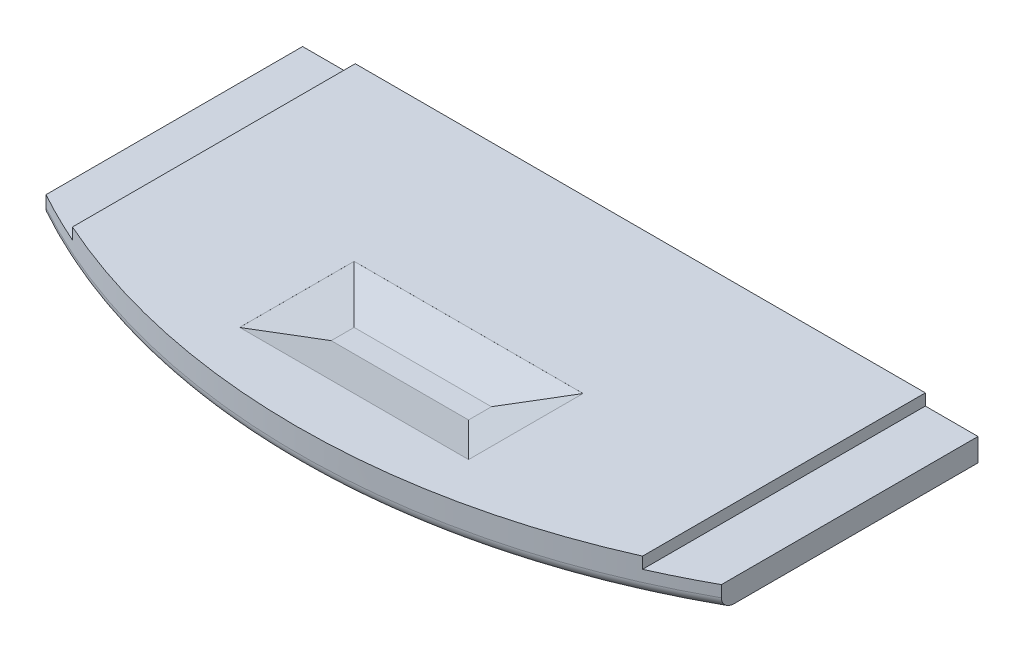
ISO-10303-21;
HEADER;
FILE_DESCRIPTION(('STEP AP214'),'2;1');
FILE_NAME('part.step','',(''),(''),'','','');
FILE_SCHEMA(('AUTOMOTIVE_DESIGN { 1 0 10303 214 1 1 1 1 }'));
ENDSEC;
DATA;
#1=APPLICATION_CONTEXT('core data for automotive mechanical design processes');
#2=APPLICATION_PROTOCOL_DEFINITION('international standard','automotive_design',2000,#1);
#3=PRODUCT_CONTEXT('',#1,'mechanical');
#4=PRODUCT('Part','Part','',(#3));
#5=PRODUCT_RELATED_PRODUCT_CATEGORY('part','',(#4));
#6=PRODUCT_DEFINITION_FORMATION('','',#4);
#7=PRODUCT_DEFINITION_CONTEXT('part definition',#1,'design');
#8=PRODUCT_DEFINITION('design','',#6,#7);
#9=PRODUCT_DEFINITION_SHAPE('','',#8);
#10=(LENGTH_UNIT() NAMED_UNIT(*) SI_UNIT(.MILLI.,.METRE.));
#11=(NAMED_UNIT(*) PLANE_ANGLE_UNIT() SI_UNIT($,.RADIAN.));
#12=(NAMED_UNIT(*) SI_UNIT($,.STERADIAN.) SOLID_ANGLE_UNIT());
#13=UNCERTAINTY_MEASURE_WITH_UNIT(LENGTH_MEASURE(1.E-05),#10,'distance_accuracy_value','');
#14=(GEOMETRIC_REPRESENTATION_CONTEXT(3) GLOBAL_UNCERTAINTY_ASSIGNED_CONTEXT((#13)) GLOBAL_UNIT_ASSIGNED_CONTEXT((#10,
#11,#12)) REPRESENTATION_CONTEXT('',''));
#15=CARTESIAN_POINT('',(0.,0.,0.));
#16=DIRECTION('',(0.,0.,1.));
#17=DIRECTION('',(1.,0.,0.));
#18=AXIS2_PLACEMENT_3D('',#15,#16,#17);
#19=CARTESIAN_POINT('',(15.8115,1.905,19.05));
#20=DIRECTION('',(0.,-1.,0.));
#21=DIRECTION('',(1.,0.,0.));
#22=AXIS2_PLACEMENT_3D('',#19,#20,#21);
#23=PLANE('',#22);
#24=DIRECTION('',(-1.,0.,0.));
#25=VECTOR('',#24,1.);
#26=CARTESIAN_POINT('',(-6.35,1.905,9.525));
#27=LINE('',#26,#25);
#28=CARTESIAN_POINT('',(6.35,1.905,9.525));
#29=VERTEX_POINT('',#28);
#30=CARTESIAN_POINT('',(-6.35,1.905,9.525));
#31=VERTEX_POINT('',#30);
#32=EDGE_CURVE('E492',#29,#31,#27,.T.);
#33=ORIENTED_EDGE('',*,*,#32,.F.);
#34=DIRECTION('',(0.,0.,-1.));
#35=VECTOR('',#34,1.);
#36=CARTESIAN_POINT('',(6.35,1.905,15.875));
#37=LINE('',#36,#35);
#38=CARTESIAN_POINT('',(6.35,1.905,15.875));
#39=VERTEX_POINT('',#38);
#40=EDGE_CURVE('E212',#39,#29,#37,.T.);
#41=ORIENTED_EDGE('',*,*,#40,.F.);
#42=DIRECTION('',(1.,0.,0.));
#43=VECTOR('',#42,1.);
#44=CARTESIAN_POINT('',(-6.35,1.905,15.875));
#45=LINE('',#44,#43);
#46=CARTESIAN_POINT('',(-6.35,1.905,15.875));
#47=VERTEX_POINT('',#46);
#48=EDGE_CURVE('E474',#47,#39,#45,.T.);
#49=ORIENTED_EDGE('',*,*,#48,.F.);
#50=DIRECTION('',(0.,0.,1.));
#51=VECTOR('',#50,1.);
#52=CARTESIAN_POINT('',(-6.35,1.905,15.875));
#53=LINE('',#52,#51);
#54=EDGE_CURVE('E497',#31,#47,#53,.T.);
#55=ORIENTED_EDGE('',*,*,#54,.F.);
#56=EDGE_LOOP('',(#33,#41,#49,#55));
#57=FACE_BOUND('',#56,.T.);
#58=DIRECTION('',(0.,0.,-1.));
#59=VECTOR('',#58,1.);
#60=CARTESIAN_POINT('',(-15.8115,1.905,19.05));
#61=LINE('',#60,#59);
#62=CARTESIAN_POINT('',(-15.8115,1.905,15.6856140175941));
#63=VERTEX_POINT('',#62);
#64=CARTESIAN_POINT('',(-15.8115,1.905,0.));
#65=VERTEX_POINT('',#64);
#66=EDGE_CURVE('E163',#63,#65,#61,.T.);
#67=ORIENTED_EDGE('',*,*,#66,.F.);
#68=CARTESIAN_POINT('',(0.,1.905,-19.7866));
#69=DIRECTION('',(0.,-1.,0.));
#70=DIRECTION('',(-1.,0.,0.));
#71=AXIS2_PLACEMENT_3D('',#68,#69,#70);
#72=CIRCLE('',#71,38.8366);
#73=CARTESIAN_POINT('',(15.8115,1.905,15.6856140175941));
#74=VERTEX_POINT('',#73);
#75=EDGE_CURVE('E149',#74,#63,#72,.T.);
#76=ORIENTED_EDGE('',*,*,#75,.F.);
#77=DIRECTION('',(0.,0.,-1.));
#78=VECTOR('',#77,1.);
#79=CARTESIAN_POINT('',(15.8115,1.905,19.05));
#80=LINE('',#79,#78);
#81=CARTESIAN_POINT('',(15.8115,1.905,0.));
#82=VERTEX_POINT('',#81);
#83=EDGE_CURVE('E161',#74,#82,#80,.T.);
#84=ORIENTED_EDGE('',*,*,#83,.T.);
#85=DIRECTION('',(-1.,0.,0.));
#86=VECTOR('',#85,1.);
#87=CARTESIAN_POINT('',(15.8115,1.905,0.));
#88=LINE('',#87,#86);
#89=EDGE_CURVE('E320',#82,#65,#88,.T.);
#90=ORIENTED_EDGE('',*,*,#89,.T.);
#91=EDGE_LOOP('',(#67,#76,#84,#90));
#92=FACE_BOUND('',#91,.T.);
#93=ADVANCED_FACE('F37',(#57,#92),#23,.F.);
#94=CARTESIAN_POINT('',(-15.8115,1.27,19.05));
#95=DIRECTION('',(0.,-1.,0.));
#96=DIRECTION('',(1.,0.,0.));
#97=AXIS2_PLACEMENT_3D('',#94,#95,#96);
#98=PLANE('',#97);
#99=DIRECTION('',(0.,0.,-1.));
#100=VECTOR('',#99,1.);
#101=CARTESIAN_POINT('',(-18.7325,1.27,19.05));
#102=LINE('',#101,#100);
#103=CARTESIAN_POINT('',(-18.7325,1.27000000000001,14.2336137458012));
#104=VERTEX_POINT('',#103);
#105=CARTESIAN_POINT('',(-18.7325,1.27,0.));
#106=VERTEX_POINT('',#105);
#107=EDGE_CURVE('E300',#104,#106,#102,.T.);
#108=ORIENTED_EDGE('',*,*,#107,.F.);
#109=CARTESIAN_POINT('',(0.,1.27,-19.7866));
#110=DIRECTION('',(0.,-1.,0.));
#111=DIRECTION('',(1.,0.,0.));
#112=AXIS2_PLACEMENT_3D('',#109,#110,#111);
#113=CIRCLE('',#112,38.8366);
#114=CARTESIAN_POINT('',(-15.8115,1.27,15.6856140175941));
#115=VERTEX_POINT('',#114);
#116=EDGE_CURVE('E330',#104,#115,#113,.F.);
#117=ORIENTED_EDGE('',*,*,#116,.T.);
#118=DIRECTION('',(0.,0.,-1.));
#119=VECTOR('',#118,1.);
#120=CARTESIAN_POINT('',(-15.8115,1.27,19.05));
#121=LINE('',#120,#119);
#122=CARTESIAN_POINT('',(-15.8115,1.27,0.));
#123=VERTEX_POINT('',#122);
#124=EDGE_CURVE('E174',#115,#123,#121,.T.);
#125=ORIENTED_EDGE('',*,*,#124,.T.);
#126=DIRECTION('',(-1.,0.,0.));
#127=VECTOR('',#126,1.);
#128=CARTESIAN_POINT('',(-15.8115,1.27,0.));
#129=LINE('',#128,#127);
#130=EDGE_CURVE('E325',#123,#106,#129,.T.);
#131=ORIENTED_EDGE('',*,*,#130,.T.);
#132=EDGE_LOOP('',(#108,#117,#125,#131));
#133=FACE_BOUND('',#132,.T.);
#134=ADVANCED_FACE('F226',(#133),#98,.F.);
#135=CARTESIAN_POINT('',(-18.7325,1.27,19.05));
#136=DIRECTION('',(1.,0.,0.));
#137=DIRECTION('',(0.,0.,-1.));
#138=AXIS2_PLACEMENT_3D('',#135,#136,#137);
#139=PLANE('',#138);
#140=DIRECTION('',(0.,0.,-1.));
#141=VECTOR('',#140,1.);
#142=CARTESIAN_POINT('',(-18.7325,0.,19.05));
#143=LINE('',#142,#141);
#144=CARTESIAN_POINT('',(-18.7325,0.,13.5068781347639));
#145=VERTEX_POINT('',#144);
#146=CARTESIAN_POINT('',(-18.7325,0.,0.));
#147=VERTEX_POINT('',#146);
#148=EDGE_CURVE('E181',#145,#147,#143,.T.);
#149=ORIENTED_EDGE('',*,*,#148,.F.);
#150=CARTESIAN_POINT('',(-18.7325,0.,13.5068781347639));
#151=CARTESIAN_POINT('',(-18.7325,-7.18038368349502E-06,13.5525097263619));
#152=CARTESIAN_POINT('',(-18.7325,0.00373725896533657,13.5981743834264));
#153=CARTESIAN_POINT('',(-18.7325,0.018749581351385,13.688454082777));
#154=CARTESIAN_POINT('',(-18.7325,0.0300509823219953,13.7330635280731));
#155=CARTESIAN_POINT('',(-18.7325,0.0602297507406202,13.8197788721495));
#156=CARTESIAN_POINT('',(-18.7325,0.0791233217712156,13.8618791937359));
#157=CARTESIAN_POINT('',(-18.7325,0.124315953022304,13.941854795761));
#158=CARTESIAN_POINT('',(-18.7325,0.150602427601653,13.9797371052418));
#159=CARTESIAN_POINT('',(-18.7325,0.207651165815531,14.0466219787454));
#160=CARTESIAN_POINT('',(-18.7325,0.237848628092664,14.076104087258));
#161=CARTESIAN_POINT('',(-18.7325,0.303456193210352,14.1286096302779));
#162=CARTESIAN_POINT('',(-18.7325,0.338863547799581,14.1516364514977));
#163=CARTESIAN_POINT('',(-18.7325,0.408613135639765,14.1871816821384));
#164=CARTESIAN_POINT('',(-18.7325,0.442445200057152,14.2007033963452));
#165=CARTESIAN_POINT('',(-18.7325,0.512003722748774,14.2210559887519));
#166=CARTESIAN_POINT('',(-18.7325,0.54772457362038,14.2279056154163));
#167=CARTESIAN_POINT('',(-18.7325,0.600781975948257,14.2328295531138));
#168=CARTESIAN_POINT('',(-18.7325,0.617896245231534,14.233625312789));
#169=CARTESIAN_POINT('',(-18.7325,0.634999999999999,14.2336137458012));
#170=B_SPLINE_CURVE_WITH_KNOTS('',3,(#150,#151,#152,#153,#154,#155,#156,#157,#158,#159,#160,
#161,#162,#163,#164,#165,#166,#167,#168,#169),.UNSPECIFIED.,.F.,.F.,(4,2,2,2,2,2,2,2,2,4),(0.,
0.136797003369236,0.274204812801076,0.411907455673943,0.549377078690826,0.675247400741318,
0.801051561864762,0.909744434593278,1.01813099328472,1.06945363196418),.UNSPECIFIED.);
#171=CARTESIAN_POINT('',(-18.7325,0.635,14.2336137458012));
#172=VERTEX_POINT('',#171);
#173=EDGE_CURVE('E65',#145,#172,#170,.T.);
#174=ORIENTED_EDGE('',*,*,#173,.T.);
#175=DIRECTION('',(0.,1.,0.));
#176=VECTOR('',#175,1.);
#177=CARTESIAN_POINT('',(-18.7325,0.,14.2336137458012));
#178=LINE('',#177,#176);
#179=EDGE_CURVE('E290',#172,#104,#178,.T.);
#180=ORIENTED_EDGE('',*,*,#179,.T.);
#181=ORIENTED_EDGE('',*,*,#107,.T.);
#182=DIRECTION('',(0.,-1.,0.));
#183=VECTOR('',#182,1.);
#184=CARTESIAN_POINT('',(-18.7325,1.27,0.));
#185=LINE('',#184,#183);
#186=EDGE_CURVE('E298',#106,#147,#185,.T.);
#187=ORIENTED_EDGE('',*,*,#186,.T.);
#188=EDGE_LOOP('',(#149,#174,#180,#181,#187));
#189=FACE_BOUND('',#188,.T.);
#190=ADVANCED_FACE('F220',(#189),#139,.F.);
#191=CARTESIAN_POINT('',(-18.7325,0.,19.05));
#192=DIRECTION('',(0.,1.,0.));
#193=DIRECTION('',(-1.,0.,0.));
#194=AXIS2_PLACEMENT_3D('',#191,#192,#193);
#195=PLANE('',#194);
#196=DIRECTION('',(0.,0.,-1.));
#197=VECTOR('',#196,1.);
#198=CARTESIAN_POINT('',(18.7325,0.,19.05));
#199=LINE('',#198,#197);
#200=CARTESIAN_POINT('',(18.7325,0.,13.5068781347639));
#201=VERTEX_POINT('',#200);
#202=CARTESIAN_POINT('',(18.7325,0.,0.));
#203=VERTEX_POINT('',#202);
#204=EDGE_CURVE('E179',#201,#203,#199,.T.);
#205=ORIENTED_EDGE('',*,*,#204,.F.);
#206=CARTESIAN_POINT('',(0.,0.,-19.7866));
#207=DIRECTION('',(0.,1.,0.));
#208=DIRECTION('',(-1.,0.,0.));
#209=AXIS2_PLACEMENT_3D('',#206,#207,#208);
#210=CIRCLE('',#209,38.2016);
#211=EDGE_CURVE('E201',#201,#145,#210,.F.);
#212=ORIENTED_EDGE('',*,*,#211,.T.);
#213=ORIENTED_EDGE('',*,*,#148,.T.);
#214=DIRECTION('',(1.,0.,0.));
#215=VECTOR('',#214,1.);
#216=CARTESIAN_POINT('',(-18.7325,0.,0.));
#217=LINE('',#216,#215);
#218=EDGE_CURVE('E304',#147,#203,#217,.T.);
#219=ORIENTED_EDGE('',*,*,#218,.T.);
#220=EDGE_LOOP('',(#205,#212,#213,#219));
#221=FACE_BOUND('',#220,.T.);
#222=ADVANCED_FACE('F225',(#221),#195,.F.);
#223=CARTESIAN_POINT('',(18.7325,0.,19.05));
#224=DIRECTION('',(-1.,0.,0.));
#225=DIRECTION('',(0.,0.,1.));
#226=AXIS2_PLACEMENT_3D('',#223,#224,#225);
#227=PLANE('',#226);
#228=DIRECTION('',(0.,1.,0.));
#229=VECTOR('',#228,1.);
#230=CARTESIAN_POINT('',(18.7325,0.,14.2336137458012));
#231=LINE('',#230,#229);
#232=CARTESIAN_POINT('',(18.7325,0.635000000000007,14.2336137458012));
#233=VERTEX_POINT('',#232);
#234=CARTESIAN_POINT('',(18.7325,1.27000000000001,14.2336137458012));
#235=VERTEX_POINT('',#234);
#236=EDGE_CURVE('E164',#233,#235,#231,.T.);
#237=ORIENTED_EDGE('',*,*,#236,.F.);
#238=CARTESIAN_POINT('',(18.7325,0.635000000000007,14.2336137458012));
#239=CARTESIAN_POINT('',(18.7325,0.602451107551194,14.2336608440877));
#240=CARTESIAN_POINT('',(18.7325,0.569936368145078,14.2307602368648));
#241=CARTESIAN_POINT('',(18.7325,0.506011958465129,14.2194427836022));
#242=CARTESIAN_POINT('',(18.7325,0.474598345644455,14.2110483281439));
#243=CARTESIAN_POINT('',(18.7325,0.413657064326774,14.18912495296));
#244=CARTESIAN_POINT('',(18.7325,0.384128025711442,14.1755998141734));
#245=CARTESIAN_POINT('',(18.7325,0.327600735123386,14.1440031869236));
#246=CARTESIAN_POINT('',(18.7325,0.300604439129042,14.1259282237704));
#247=CARTESIAN_POINT('',(18.7325,0.248455616349783,14.084945511528));
#248=CARTESIAN_POINT('',(18.7325,0.22345254343684,14.0618483068935));
#249=CARTESIAN_POINT('',(18.7325,0.177186522303371,14.0121874903605));
#250=CARTESIAN_POINT('',(18.7325,0.155924322413831,13.9856231867443));
#251=CARTESIAN_POINT('',(18.7325,0.115093372565428,13.9264813773413));
#252=CARTESIAN_POINT('',(18.7325,0.0960172456732509,13.8935640768571));
#253=CARTESIAN_POINT('',(18.7325,0.0629571018671682,13.8252420870077));
#254=CARTESIAN_POINT('',(18.7325,0.0489787519119618,13.7898346813302));
#255=CARTESIAN_POINT('',(18.7325,0.0250461597425407,13.7137426602569));
#256=CARTESIAN_POINT('',(18.7325,0.015639896280906,13.6728859510476));
#257=CARTESIAN_POINT('',(18.7325,0.00312011287666644,13.5903016487957));
#258=CARTESIAN_POINT('',(18.7325,-6.24406686617483E-06,13.5485760088486));
#259=CARTESIAN_POINT('',(18.7325,0.,13.5068781347639));
#260=B_SPLINE_CURVE_WITH_KNOTS('',3,(#238,#239,#240,#241,#242,#243,#244,#245,#246,#247,#248,
#249,#250,#251,#252,#253,#254,#255,#256,#257,#258,#259),.UNSPECIFIED.,.F.,.F.,(4,2,2,2,2,2,2,2,
2,2,4),(0.,0.0974641339979622,0.194533498897658,0.291531469290527,0.388603742744613,
0.490308157582893,0.592032894480588,0.705711678471261,0.81951645136196,0.944798062571179,
1.06982331909117),.UNSPECIFIED.);
#261=EDGE_CURVE('E11',#233,#201,#260,.T.);
#262=ORIENTED_EDGE('',*,*,#261,.T.);
#263=ORIENTED_EDGE('',*,*,#204,.T.);
#264=DIRECTION('',(0.,1.,0.));
#265=VECTOR('',#264,1.);
#266=CARTESIAN_POINT('',(18.7325,0.,0.));
#267=LINE('',#266,#265);
#268=CARTESIAN_POINT('',(18.7325,1.27000000000001,0.));
#269=VERTEX_POINT('',#268);
#270=EDGE_CURVE('E307',#203,#269,#267,.T.);
#271=ORIENTED_EDGE('',*,*,#270,.T.);
#272=DIRECTION('',(0.,0.,-1.));
#273=VECTOR('',#272,1.);
#274=CARTESIAN_POINT('',(18.7325,1.27000000000001,19.05));
#275=LINE('',#274,#273);
#276=EDGE_CURVE('E172',#235,#269,#275,.T.);
#277=ORIENTED_EDGE('',*,*,#276,.F.);
#278=EDGE_LOOP('',(#237,#262,#263,#271,#277));
#279=FACE_BOUND('',#278,.T.);
#280=ADVANCED_FACE('F277',(#279),#227,.F.);
#281=CARTESIAN_POINT('',(18.7325,1.27000000000001,19.05));
#282=DIRECTION('',(0.,-1.,0.));
#283=DIRECTION('',(1.,0.,0.));
#284=AXIS2_PLACEMENT_3D('',#281,#282,#283);
#285=PLANE('',#284);
#286=DIRECTION('',(0.,0.,-1.));
#287=VECTOR('',#286,1.);
#288=CARTESIAN_POINT('',(15.8115,1.27000000000001,19.05));
#289=LINE('',#288,#287);
#290=CARTESIAN_POINT('',(15.8115,1.27000000000001,15.6856140175941));
#291=VERTEX_POINT('',#290);
#292=CARTESIAN_POINT('',(15.8115,1.27000000000001,0.));
#293=VERTEX_POINT('',#292);
#294=EDGE_CURVE('E170',#291,#293,#289,.T.);
#295=ORIENTED_EDGE('',*,*,#294,.F.);
#296=CARTESIAN_POINT('',(0.,1.27,-19.7866));
#297=DIRECTION('',(0.,-1.,0.));
#298=DIRECTION('',(1.,0.,0.));
#299=AXIS2_PLACEMENT_3D('',#296,#297,#298);
#300=CIRCLE('',#299,38.8366);
#301=EDGE_CURVE('E152',#291,#235,#300,.F.);
#302=ORIENTED_EDGE('',*,*,#301,.T.);
#303=ORIENTED_EDGE('',*,*,#276,.T.);
#304=DIRECTION('',(-1.,0.,0.));
#305=VECTOR('',#304,1.);
#306=CARTESIAN_POINT('',(18.7325,1.27000000000001,0.));
#307=LINE('',#306,#305);
#308=EDGE_CURVE('E316',#269,#293,#307,.T.);
#309=ORIENTED_EDGE('',*,*,#308,.T.);
#310=EDGE_LOOP('',(#295,#302,#303,#309));
#311=FACE_BOUND('',#310,.T.);
#312=ADVANCED_FACE('F275',(#311),#285,.F.);
#313=CARTESIAN_POINT('',(15.8115,1.27000000000001,19.05));
#314=DIRECTION('',(-1.,0.,0.));
#315=DIRECTION('',(0.,0.,1.));
#316=AXIS2_PLACEMENT_3D('',#313,#314,#315);
#317=PLANE('',#316);
#318=ORIENTED_EDGE('',*,*,#83,.F.);
#319=DIRECTION('',(0.,1.,0.));
#320=VECTOR('',#319,1.);
#321=CARTESIAN_POINT('',(15.8115,0.,15.6856140175941));
#322=LINE('',#321,#320);
#323=EDGE_CURVE('E146',#74,#291,#322,.F.);
#324=ORIENTED_EDGE('',*,*,#323,.T.);
#325=ORIENTED_EDGE('',*,*,#294,.T.);
#326=DIRECTION('',(0.,1.,0.));
#327=VECTOR('',#326,1.);
#328=CARTESIAN_POINT('',(15.8115,1.27000000000001,0.));
#329=LINE('',#328,#327);
#330=EDGE_CURVE('E168',#293,#82,#329,.T.);
#331=ORIENTED_EDGE('',*,*,#330,.T.);
#332=EDGE_LOOP('',(#318,#324,#325,#331));
#333=FACE_BOUND('',#332,.T.);
#334=ADVANCED_FACE('F166',(#333),#317,.F.);
#335=CARTESIAN_POINT('',(-15.8115,1.905,19.05));
#336=DIRECTION('',(1.,0.,0.));
#337=DIRECTION('',(0.,0.,-1.));
#338=AXIS2_PLACEMENT_3D('',#335,#336,#337);
#339=PLANE('',#338);
#340=ORIENTED_EDGE('',*,*,#124,.F.);
#341=DIRECTION('',(0.,1.,0.));
#342=VECTOR('',#341,1.);
#343=CARTESIAN_POINT('',(-15.8115,0.,15.6856140175941));
#344=LINE('',#343,#342);
#345=EDGE_CURVE('E156',#115,#63,#344,.T.);
#346=ORIENTED_EDGE('',*,*,#345,.T.);
#347=ORIENTED_EDGE('',*,*,#66,.T.);
#348=DIRECTION('',(0.,-1.,0.));
#349=VECTOR('',#348,1.);
#350=CARTESIAN_POINT('',(-15.8115,1.905,0.));
#351=LINE('',#350,#349);
#352=EDGE_CURVE('E322',#65,#123,#351,.T.);
#353=ORIENTED_EDGE('',*,*,#352,.T.);
#354=EDGE_LOOP('',(#340,#346,#347,#353));
#355=FACE_BOUND('',#354,.T.);
#356=ADVANCED_FACE('F272',(#355),#339,.F.);
#357=CARTESIAN_POINT('',(0.,0.,0.));
#358=DIRECTION('',(0.,0.,1.));
#359=DIRECTION('',(1.,0.,0.));
#360=AXIS2_PLACEMENT_3D('',#357,#358,#359);
#361=PLANE('',#360);
#362=ORIENTED_EDGE('',*,*,#186,.F.);
#363=ORIENTED_EDGE('',*,*,#130,.F.);
#364=ORIENTED_EDGE('',*,*,#352,.F.);
#365=ORIENTED_EDGE('',*,*,#89,.F.);
#366=ORIENTED_EDGE('',*,*,#330,.F.);
#367=ORIENTED_EDGE('',*,*,#308,.F.);
#368=ORIENTED_EDGE('',*,*,#270,.F.);
#369=ORIENTED_EDGE('',*,*,#218,.F.);
#370=EDGE_LOOP('',(#362,#363,#364,#365,#366,#367,#368,#369));
#371=FACE_BOUND('',#370,.T.);
#372=ADVANCED_FACE('F333',(#371),#361,.F.);
#373=CARTESIAN_POINT('',(6.35,1.27,15.875));
#374=DIRECTION('',(1.,0.,0.));
#375=DIRECTION('',(0.,1.,0.));
#376=AXIS2_PLACEMENT_3D('',#373,#374,#375);
#377=PLANE('',#376);
#378=DIRECTION('',(0.,1.,0.));
#379=VECTOR('',#378,1.);
#380=CARTESIAN_POINT('',(6.35,1.27,9.525));
#381=LINE('',#380,#379);
#382=CARTESIAN_POINT('',(6.35,1.90329312722168,9.525));
#383=VERTEX_POINT('',#382);
#384=EDGE_CURVE('E312',#383,#29,#381,.T.);
#385=ORIENTED_EDGE('',*,*,#384,.F.);
#386=DIRECTION('',(0.,0.,1.));
#387=VECTOR('',#386,1.);
#388=CARTESIAN_POINT('',(6.35,1.90329312722168,15.875));
#389=LINE('',#388,#387);
#390=CARTESIAN_POINT('',(6.35,1.90329312722168,15.875));
#391=VERTEX_POINT('',#390);
#392=EDGE_CURVE('E199',#383,#391,#389,.T.);
#393=ORIENTED_EDGE('',*,*,#392,.T.);
#394=DIRECTION('',(0.,1.,0.));
#395=VECTOR('',#394,1.);
#396=CARTESIAN_POINT('',(6.35,1.27,15.875));
#397=LINE('',#396,#395);
#398=EDGE_CURVE('E305',#391,#39,#397,.T.);
#399=ORIENTED_EDGE('',*,*,#398,.T.);
#400=ORIENTED_EDGE('',*,*,#40,.T.);
#401=EDGE_LOOP('',(#385,#393,#399,#400));
#402=FACE_BOUND('',#401,.T.);
#403=ADVANCED_FACE('F335',(#402),#377,.F.);
#404=CARTESIAN_POINT('',(-6.35,1.27,15.875));
#405=DIRECTION('',(0.,0.,1.));
#406=DIRECTION('',(1.,0.,0.));
#407=AXIS2_PLACEMENT_3D('',#404,#405,#406);
#408=PLANE('',#407);
#409=ORIENTED_EDGE('',*,*,#398,.F.);
#410=DIRECTION('',(-1.,0.,0.));
#411=VECTOR('',#410,1.);
#412=CARTESIAN_POINT('',(-6.35,1.90329312722168,15.875));
#413=LINE('',#412,#411);
#414=CARTESIAN_POINT('',(-6.35,1.90329312722168,15.875));
#415=VERTEX_POINT('',#414);
#416=EDGE_CURVE('E192',#391,#415,#413,.T.);
#417=ORIENTED_EDGE('',*,*,#416,.T.);
#418=DIRECTION('',(0.,1.,0.));
#419=VECTOR('',#418,1.);
#420=CARTESIAN_POINT('',(-6.35,1.27,15.875));
#421=LINE('',#420,#419);
#422=EDGE_CURVE('E309',#415,#47,#421,.T.);
#423=ORIENTED_EDGE('',*,*,#422,.T.);
#424=ORIENTED_EDGE('',*,*,#48,.T.);
#425=EDGE_LOOP('',(#409,#417,#423,#424));
#426=FACE_BOUND('',#425,.T.);
#427=ADVANCED_FACE('F341',(#426),#408,.F.);
#428=CARTESIAN_POINT('',(-6.35,1.27,15.875));
#429=DIRECTION('',(-1.,0.,0.));
#430=DIRECTION('',(0.,-1.,0.));
#431=AXIS2_PLACEMENT_3D('',#428,#429,#430);
#432=PLANE('',#431);
#433=ORIENTED_EDGE('',*,*,#422,.F.);
#434=DIRECTION('',(0.,0.,-1.));
#435=VECTOR('',#434,1.);
#436=CARTESIAN_POINT('',(-6.35,1.90329312722168,9.525));
#437=LINE('',#436,#435);
#438=CARTESIAN_POINT('',(-6.35,1.90329312722168,9.525));
#439=VERTEX_POINT('',#438);
#440=EDGE_CURVE('E195',#415,#439,#437,.T.);
#441=ORIENTED_EDGE('',*,*,#440,.T.);
#442=DIRECTION('',(0.,1.,0.));
#443=VECTOR('',#442,1.);
#444=CARTESIAN_POINT('',(-6.35,1.27,9.525));
#445=LINE('',#444,#443);
#446=EDGE_CURVE('E488',#439,#31,#445,.T.);
#447=ORIENTED_EDGE('',*,*,#446,.T.);
#448=ORIENTED_EDGE('',*,*,#54,.T.);
#449=EDGE_LOOP('',(#433,#441,#447,#448));
#450=FACE_BOUND('',#449,.T.);
#451=ADVANCED_FACE('F347',(#450),#432,.F.);
#452=CARTESIAN_POINT('',(-6.35,1.27,9.525));
#453=DIRECTION('',(0.,0.,-1.));
#454=DIRECTION('',(-1.,0.,0.));
#455=AXIS2_PLACEMENT_3D('',#452,#453,#454);
#456=PLANE('',#455);
#457=ORIENTED_EDGE('',*,*,#446,.F.);
#458=DIRECTION('',(1.,0.,0.));
#459=VECTOR('',#458,1.);
#460=CARTESIAN_POINT('',(6.35,1.90329312722168,9.525));
#461=LINE('',#460,#459);
#462=EDGE_CURVE('E197',#439,#383,#461,.T.);
#463=ORIENTED_EDGE('',*,*,#462,.T.);
#464=ORIENTED_EDGE('',*,*,#384,.T.);
#465=ORIENTED_EDGE('',*,*,#32,.T.);
#466=EDGE_LOOP('',(#457,#463,#464,#465));
#467=FACE_BOUND('',#466,.T.);
#468=ADVANCED_FACE('F257',(#467),#456,.F.);
#469=CARTESIAN_POINT('',(0.,1.27,0.));
#470=DIRECTION('',(0.,-1.,0.));
#471=DIRECTION('',(1.,0.,0.));
#472=AXIS2_PLACEMENT_3D('',#469,#470,#471);
#473=PLANE('',#472);
#474=DIRECTION('',(0.,0.,1.));
#475=VECTOR('',#474,1.);
#476=CARTESIAN_POINT('',(-3.81000000000003,1.27,15.875));
#477=LINE('',#476,#475);
#478=CARTESIAN_POINT('',(-3.81000000000003,1.27,12.065));
#479=VERTEX_POINT('',#478);
#480=CARTESIAN_POINT('',(-3.81000000000003,1.27,13.335));
#481=VERTEX_POINT('',#480);
#482=EDGE_CURVE('E187',#479,#481,#477,.T.);
#483=ORIENTED_EDGE('',*,*,#482,.T.);
#484=DIRECTION('',(1.,0.,0.));
#485=VECTOR('',#484,1.);
#486=CARTESIAN_POINT('',(6.35,1.27,13.335));
#487=LINE('',#486,#485);
#488=CARTESIAN_POINT('',(3.81000000000004,1.27,13.335));
#489=VERTEX_POINT('',#488);
#490=EDGE_CURVE('E189',#481,#489,#487,.T.);
#491=ORIENTED_EDGE('',*,*,#490,.T.);
#492=DIRECTION('',(0.,0.,-1.));
#493=VECTOR('',#492,1.);
#494=CARTESIAN_POINT('',(3.81000000000004,1.27,9.525));
#495=LINE('',#494,#493);
#496=CARTESIAN_POINT('',(3.81000000000004,1.27,12.065));
#497=VERTEX_POINT('',#496);
#498=EDGE_CURVE('E183',#489,#497,#495,.T.);
#499=ORIENTED_EDGE('',*,*,#498,.T.);
#500=DIRECTION('',(-1.,0.,0.));
#501=VECTOR('',#500,1.);
#502=CARTESIAN_POINT('',(-6.35,1.27,12.065));
#503=LINE('',#502,#501);
#504=EDGE_CURVE('E185',#497,#479,#503,.T.);
#505=ORIENTED_EDGE('',*,*,#504,.T.);
#506=EDGE_LOOP('',(#483,#491,#499,#505));
#507=FACE_BOUND('',#506,.T.);
#508=ADVANCED_FACE('F252',(#507),#473,.F.);
#509=CARTESIAN_POINT('',(0.,1.27,12.065));
#510=DIRECTION('',(0.,0.970295726275995,0.241921895599672));
#511=DIRECTION('',(1.,0.,0.));
#512=AXIS2_PLACEMENT_3D('',#509,#510,#511);
#513=PLANE('',#512);
#514=DIRECTION('',(-0.696367271932416,-0.173623861156267,0.696367271932416));
#515=VECTOR('',#514,1.);
#516=CARTESIAN_POINT('',(1.96242669203517,0.809348237018742,13.9125733079648));
#517=LINE('',#516,#515);
#518=EDGE_CURVE('E206',#383,#497,#517,.T.);
#519=ORIENTED_EDGE('',*,*,#518,.F.);
#520=ORIENTED_EDGE('',*,*,#462,.F.);
#521=DIRECTION('',(0.696367271932415,-0.173623861156266,0.696367271932416));
#522=VECTOR('',#521,1.);
#523=CARTESIAN_POINT('',(-9.66064880855536,2.72873058277396,6.21435119144464));
#524=LINE('',#523,#522);
#525=EDGE_CURVE('E209',#479,#439,#524,.F.);
#526=ORIENTED_EDGE('',*,*,#525,.F.);
#527=ORIENTED_EDGE('',*,*,#504,.F.);
#528=EDGE_LOOP('',(#519,#520,#526,#527));
#529=FACE_BOUND('',#528,.T.);
#530=ADVANCED_FACE('F247',(#529),#513,.T.);
#531=CARTESIAN_POINT('',(-3.81000000000003,1.27,0.));
#532=DIRECTION('',(0.241921895599672,0.970295726275995,0.));
#533=DIRECTION('',(0.,0.,-1.));
#534=AXIS2_PLACEMENT_3D('',#531,#532,#533);
#535=PLANE('',#534);
#536=ORIENTED_EDGE('',*,*,#525,.T.);
#537=ORIENTED_EDGE('',*,*,#440,.F.);
#538=DIRECTION('',(0.696367271932415,-0.173623861156266,-0.696367271932416));
#539=VECTOR('',#538,1.);
#540=CARTESIAN_POINT('',(-1.96242669203517,0.809348237018742,11.4874266920352));
#541=LINE('',#540,#539);
#542=EDGE_CURVE('E204',#481,#415,#541,.F.);
#543=ORIENTED_EDGE('',*,*,#542,.F.);
#544=ORIENTED_EDGE('',*,*,#482,.F.);
#545=EDGE_LOOP('',(#536,#537,#543,#544));
#546=FACE_BOUND('',#545,.T.);
#547=ADVANCED_FACE('F241',(#546),#535,.T.);
#548=CARTESIAN_POINT('',(3.81000000000004,1.27,0.));
#549=DIRECTION('',(-0.241921895599672,0.970295726275995,0.));
#550=DIRECTION('',(0.,0.,1.));
#551=AXIS2_PLACEMENT_3D('',#548,#549,#550);
#552=PLANE('',#551);
#553=ORIENTED_EDGE('',*,*,#518,.T.);
#554=ORIENTED_EDGE('',*,*,#498,.F.);
#555=DIRECTION('',(0.696367271932416,0.173623861156267,0.696367271932416));
#556=VECTOR('',#555,1.);
#557=CARTESIAN_POINT('',(1.96242669203517,0.809348237018742,11.4874266920352));
#558=LINE('',#557,#556);
#559=EDGE_CURVE('E202',#391,#489,#558,.F.);
#560=ORIENTED_EDGE('',*,*,#559,.F.);
#561=ORIENTED_EDGE('',*,*,#392,.F.);
#562=EDGE_LOOP('',(#553,#554,#560,#561));
#563=FACE_BOUND('',#562,.T.);
#564=ADVANCED_FACE('F234',(#563),#552,.T.);
#565=CARTESIAN_POINT('',(0.,1.27,13.335));
#566=DIRECTION('',(0.,0.970295726275995,-0.241921895599672));
#567=DIRECTION('',(-1.,0.,0.));
#568=AXIS2_PLACEMENT_3D('',#565,#566,#567);
#569=PLANE('',#568);
#570=ORIENTED_EDGE('',*,*,#542,.T.);
#571=ORIENTED_EDGE('',*,*,#416,.F.);
#572=ORIENTED_EDGE('',*,*,#559,.T.);
#573=ORIENTED_EDGE('',*,*,#490,.F.);
#574=EDGE_LOOP('',(#570,#571,#572,#573));
#575=FACE_BOUND('',#574,.T.);
#576=ADVANCED_FACE('F228',(#575),#569,.T.);
#577=CARTESIAN_POINT('',(0.,0.,-19.7866));
#578=DIRECTION('',(0.,1.,0.));
#579=DIRECTION('',(-1.,0.,0.));
#580=AXIS2_PLACEMENT_3D('',#577,#578,#579);
#581=CYLINDRICAL_SURFACE('',#580,38.8366);
#582=ORIENTED_EDGE('',*,*,#179,.F.);
#583=CARTESIAN_POINT('',(0.,0.635000000000003,-19.7866));
#584=DIRECTION('',(0.,1.,0.));
#585=DIRECTION('',(-1.,0.,0.));
#586=AXIS2_PLACEMENT_3D('',#583,#584,#585);
#587=CIRCLE('',#586,38.8366);
#588=EDGE_CURVE('E51',#172,#233,#587,.T.);
#589=ORIENTED_EDGE('',*,*,#588,.T.);
#590=ORIENTED_EDGE('',*,*,#236,.T.);
#591=ORIENTED_EDGE('',*,*,#301,.F.);
#592=ORIENTED_EDGE('',*,*,#323,.F.);
#593=ORIENTED_EDGE('',*,*,#75,.T.);
#594=ORIENTED_EDGE('',*,*,#345,.F.);
#595=ORIENTED_EDGE('',*,*,#116,.F.);
#596=EDGE_LOOP('',(#582,#589,#590,#591,#592,#593,#594,#595));
#597=FACE_BOUND('',#596,.T.);
#598=ADVANCED_FACE('F148',(#597),#581,.T.);
#599=CARTESIAN_POINT('',(0.,0.635000000000003,-19.7866));
#600=DIRECTION('',(0.,1.,0.));
#601=DIRECTION('',(-1.,0.,0.));
#602=AXIS2_PLACEMENT_3D('',#599,#600,#601);
#603=TOROIDAL_SURFACE('',#602,38.2016,0.635);
#604=ORIENTED_EDGE('',*,*,#261,.F.);
#605=ORIENTED_EDGE('',*,*,#588,.F.);
#606=ORIENTED_EDGE('',*,*,#173,.F.);
#607=ORIENTED_EDGE('',*,*,#211,.F.);
#608=EDGE_LOOP('',(#604,#605,#606,#607));
#609=FACE_BOUND('',#608,.T.);
#610=ADVANCED_FACE('F39',(#609),#603,.T.);
#611=CLOSED_SHELL('',(#93,#134,#190,#222,#280,#312,#334,#356,#372,#403,#427,#451,#468,#508,#530,
#547,#564,#576,#598,#610));
#612=MANIFOLD_SOLID_BREP('B2',#611);
#613=ADVANCED_BREP_SHAPE_REPRESENTATION('',(#18,#612),#14);
#614=SHAPE_DEFINITION_REPRESENTATION(#9,#613);
ENDSEC;
END-ISO-10303-21;
